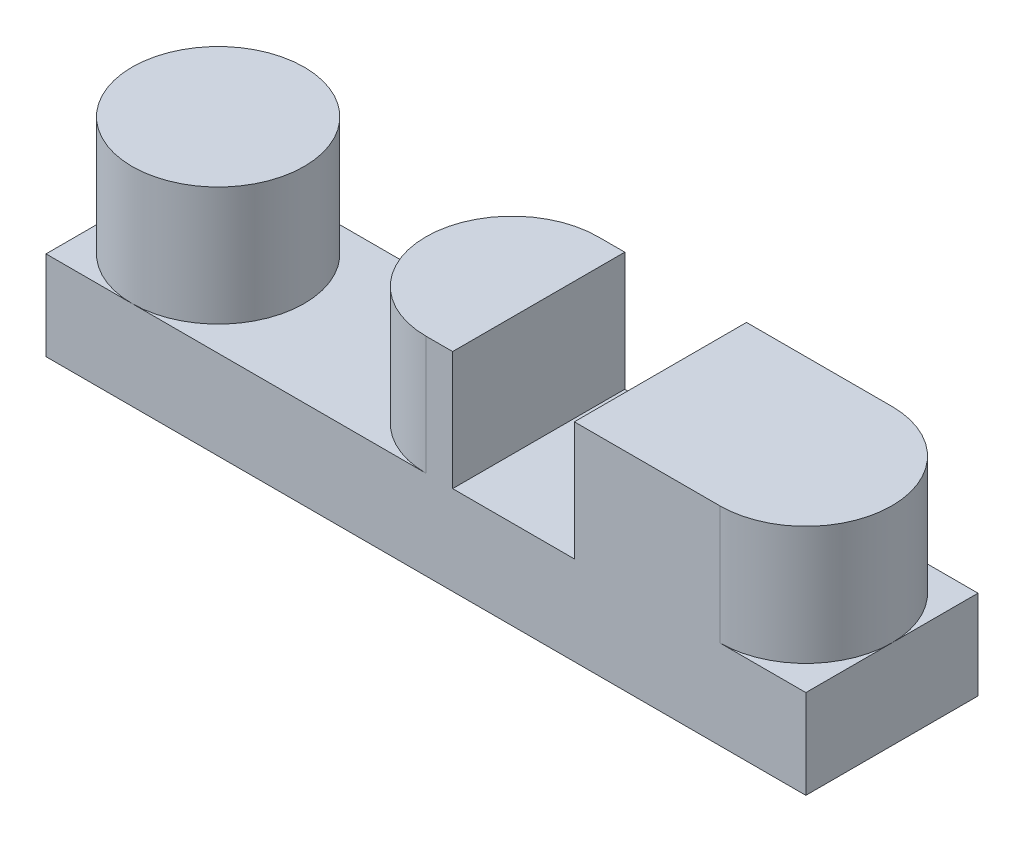
ISO-10303-21;
HEADER;
FILE_DESCRIPTION(('STEP AP214'),'2;1');
FILE_NAME('part.step','',(''),(''),'','','');
FILE_SCHEMA(('AUTOMOTIVE_DESIGN { 1 0 10303 214 1 1 1 1 }'));
ENDSEC;
DATA;
#1=APPLICATION_CONTEXT('core data for automotive mechanical design processes');
#2=APPLICATION_PROTOCOL_DEFINITION('international standard','automotive_design',2000,#1);
#3=PRODUCT_CONTEXT('',#1,'mechanical');
#4=PRODUCT('Part','Part','',(#3));
#5=PRODUCT_RELATED_PRODUCT_CATEGORY('part','',(#4));
#6=PRODUCT_DEFINITION_FORMATION('','',#4);
#7=PRODUCT_DEFINITION_CONTEXT('part definition',#1,'design');
#8=PRODUCT_DEFINITION('design','',#6,#7);
#9=PRODUCT_DEFINITION_SHAPE('','',#8);
#10=(LENGTH_UNIT() NAMED_UNIT(*) SI_UNIT(.MILLI.,.METRE.));
#11=(NAMED_UNIT(*) PLANE_ANGLE_UNIT() SI_UNIT($,.RADIAN.));
#12=(NAMED_UNIT(*) SI_UNIT($,.STERADIAN.) SOLID_ANGLE_UNIT());
#13=UNCERTAINTY_MEASURE_WITH_UNIT(LENGTH_MEASURE(1.E-05),#10,'distance_accuracy_value','');
#14=(GEOMETRIC_REPRESENTATION_CONTEXT(3) GLOBAL_UNCERTAINTY_ASSIGNED_CONTEXT((#13)) GLOBAL_UNIT_ASSIGNED_CONTEXT((#10,
#11,#12)) REPRESENTATION_CONTEXT('',''));
#15=CARTESIAN_POINT('',(0.,0.,0.));
#16=DIRECTION('',(0.,0.,1.));
#17=DIRECTION('',(1.,0.,0.));
#18=AXIS2_PLACEMENT_3D('',#15,#16,#17);
#19=CARTESIAN_POINT('',(0.,0.,0.));
#20=DIRECTION('',(0.,-1.,0.));
#21=DIRECTION('',(0.,0.,-1.));
#22=AXIS2_PLACEMENT_3D('',#19,#20,#21);
#23=PLANE('',#22);
#24=CARTESIAN_POINT('',(2.9,0.,-2.9));
#25=DIRECTION('',(0.,1.,0.));
#26=DIRECTION('',(0.,0.,1.));
#27=AXIS2_PLACEMENT_3D('',#24,#25,#26);
#28=CIRCLE('',#27,2.9);
#29=CARTESIAN_POINT('',(2.9,0.,0.));
#30=VERTEX_POINT('',#29);
#31=CARTESIAN_POINT('',(2.9,0.,-5.8));
#32=VERTEX_POINT('',#31);
#33=EDGE_CURVE('E59',#30,#32,#28,.T.);
#34=ORIENTED_EDGE('',*,*,#33,.F.);
#35=DIRECTION('',(1.,0.,0.));
#36=VECTOR('',#35,1.);
#37=CARTESIAN_POINT('',(0.,0.,0.));
#38=LINE('',#37,#36);
#39=CARTESIAN_POINT('',(12.8,0.,0.));
#40=VERTEX_POINT('',#39);
#41=EDGE_CURVE('E259',#30,#40,#38,.T.);
#42=ORIENTED_EDGE('',*,*,#41,.T.);
#43=CARTESIAN_POINT('',(12.8,0.,-2.9));
#44=DIRECTION('',(0.,1.,0.));
#45=DIRECTION('',(0.,0.,1.));
#46=AXIS2_PLACEMENT_3D('',#43,#44,#45);
#47=CIRCLE('',#46,2.9);
#48=CARTESIAN_POINT('',(12.8,0.,-5.8));
#49=VERTEX_POINT('',#48);
#50=EDGE_CURVE('E74',#49,#40,#47,.T.);
#51=ORIENTED_EDGE('',*,*,#50,.F.);
#52=DIRECTION('',(1.,0.,0.));
#53=VECTOR('',#52,1.);
#54=CARTESIAN_POINT('',(0.,0.,-5.8));
#55=LINE('',#54,#53);
#56=EDGE_CURVE('E251',#32,#49,#55,.T.);
#57=ORIENTED_EDGE('',*,*,#56,.F.);
#58=EDGE_LOOP('',(#34,#42,#51,#57));
#59=FACE_BOUND('',#58,.T.);
#60=ADVANCED_FACE('F47',(#59),#23,.F.);
#61=CARTESIAN_POINT('',(0.,0.,-2.9));
#62=VERTEX_POINT('',#61);
#63=EDGE_CURVE('E11',#32,#62,#28,.T.);
#64=ORIENTED_EDGE('',*,*,#63,.F.);
#65=CARTESIAN_POINT('',(0.,0.,-5.8));
#66=VERTEX_POINT('',#65);
#67=EDGE_CURVE('E246',#66,#32,#55,.T.);
#68=ORIENTED_EDGE('',*,*,#67,.F.);
#69=DIRECTION('',(0.,0.,-1.));
#70=VECTOR('',#69,1.);
#71=CARTESIAN_POINT('',(0.,0.,0.));
#72=LINE('',#71,#70);
#73=EDGE_CURVE('E245',#62,#66,#72,.T.);
#74=ORIENTED_EDGE('',*,*,#73,.F.);
#75=EDGE_LOOP('',(#64,#68,#74));
#76=FACE_BOUND('',#75,.T.);
#77=ADVANCED_FACE('F341',(#76),#23,.F.);
#78=EDGE_CURVE('E57',#62,#30,#28,.T.);
#79=ORIENTED_EDGE('',*,*,#78,.F.);
#80=CARTESIAN_POINT('',(0.,0.,0.));
#81=VERTEX_POINT('',#80);
#82=EDGE_CURVE('E240',#81,#62,#72,.T.);
#83=ORIENTED_EDGE('',*,*,#82,.F.);
#84=EDGE_CURVE('E228',#81,#30,#38,.T.);
#85=ORIENTED_EDGE('',*,*,#84,.T.);
#86=EDGE_LOOP('',(#79,#83,#85));
#87=FACE_BOUND('',#86,.T.);
#88=ADVANCED_FACE('F346',(#87),#23,.F.);
#89=DIRECTION('',(0.,0.,-1.));
#90=VECTOR('',#89,1.);
#91=CARTESIAN_POINT('',(13.7,0.,0.));
#92=LINE('',#91,#90);
#93=CARTESIAN_POINT('',(13.7,0.,0.));
#94=VERTEX_POINT('',#93);
#95=CARTESIAN_POINT('',(13.7,0.,-5.8));
#96=VERTEX_POINT('',#95);
#97=EDGE_CURVE('E178',#94,#96,#92,.T.);
#98=ORIENTED_EDGE('',*,*,#97,.F.);
#99=CARTESIAN_POINT('',(17.8,0.,0.));
#100=VERTEX_POINT('',#99);
#101=EDGE_CURVE('E306',#94,#100,#38,.T.);
#102=ORIENTED_EDGE('',*,*,#101,.T.);
#103=DIRECTION('',(0.,0.,-1.));
#104=VECTOR('',#103,1.);
#105=CARTESIAN_POINT('',(17.8,0.,0.));
#106=LINE('',#105,#104);
#107=CARTESIAN_POINT('',(17.8,0.,-5.8));
#108=VERTEX_POINT('',#107);
#109=EDGE_CURVE('E195',#100,#108,#106,.T.);
#110=ORIENTED_EDGE('',*,*,#109,.T.);
#111=EDGE_CURVE('E300',#96,#108,#55,.T.);
#112=ORIENTED_EDGE('',*,*,#111,.F.);
#113=EDGE_LOOP('',(#98,#102,#110,#112));
#114=FACE_BOUND('',#113,.T.);
#115=ADVANCED_FACE('F305',(#114),#23,.F.);
#116=CARTESIAN_POINT('',(22.7,0.,-2.9));
#117=DIRECTION('',(0.,1.,0.));
#118=DIRECTION('',(0.,0.,1.));
#119=AXIS2_PLACEMENT_3D('',#116,#117,#118);
#120=CIRCLE('',#119,2.9);
#121=CARTESIAN_POINT('',(22.7,0.,0.));
#122=VERTEX_POINT('',#121);
#123=CARTESIAN_POINT('',(25.6,0.,-2.9));
#124=VERTEX_POINT('',#123);
#125=EDGE_CURVE('E206',#122,#124,#120,.T.);
#126=ORIENTED_EDGE('',*,*,#125,.F.);
#127=CARTESIAN_POINT('',(25.6,0.,0.));
#128=VERTEX_POINT('',#127);
#129=EDGE_CURVE('E256',#122,#128,#38,.T.);
#130=ORIENTED_EDGE('',*,*,#129,.T.);
#131=DIRECTION('',(0.,0.,-1.));
#132=VECTOR('',#131,1.);
#133=CARTESIAN_POINT('',(25.6,0.,0.));
#134=LINE('',#133,#132);
#135=EDGE_CURVE('E252',#128,#124,#134,.T.);
#136=ORIENTED_EDGE('',*,*,#135,.T.);
#137=EDGE_LOOP('',(#126,#130,#136));
#138=FACE_BOUND('',#137,.T.);
#139=ADVANCED_FACE('F314',(#138),#23,.F.);
#140=CARTESIAN_POINT('',(22.7,0.,-5.8));
#141=VERTEX_POINT('',#140);
#142=EDGE_CURVE('E209',#124,#141,#120,.T.);
#143=ORIENTED_EDGE('',*,*,#142,.F.);
#144=CARTESIAN_POINT('',(25.6,0.,-5.8));
#145=VERTEX_POINT('',#144);
#146=EDGE_CURVE('E250',#124,#145,#134,.T.);
#147=ORIENTED_EDGE('',*,*,#146,.T.);
#148=EDGE_CURVE('E244',#141,#145,#55,.T.);
#149=ORIENTED_EDGE('',*,*,#148,.F.);
#150=EDGE_LOOP('',(#143,#147,#149));
#151=FACE_BOUND('',#150,.T.);
#152=ADVANCED_FACE('F349',(#151),#23,.F.);
#153=CARTESIAN_POINT('',(0.,-3.,0.));
#154=DIRECTION('',(1.,0.,0.));
#155=DIRECTION('',(0.,0.,-1.));
#156=AXIS2_PLACEMENT_3D('',#153,#154,#155);
#157=PLANE('',#156);
#158=ORIENTED_EDGE('',*,*,#82,.T.);
#159=ORIENTED_EDGE('',*,*,#73,.T.);
#160=DIRECTION('',(0.,1.,0.));
#161=VECTOR('',#160,1.);
#162=CARTESIAN_POINT('',(0.,-3.,-5.8));
#163=LINE('',#162,#161);
#164=CARTESIAN_POINT('',(0.,-3.,-5.8));
#165=VERTEX_POINT('',#164);
#166=EDGE_CURVE('E51',#165,#66,#163,.T.);
#167=ORIENTED_EDGE('',*,*,#166,.F.);
#168=DIRECTION('',(0.,0.,-1.));
#169=VECTOR('',#168,1.);
#170=CARTESIAN_POINT('',(0.,-3.,0.));
#171=LINE('',#170,#169);
#172=CARTESIAN_POINT('',(0.,-3.,0.));
#173=VERTEX_POINT('',#172);
#174=EDGE_CURVE('E223',#173,#165,#171,.T.);
#175=ORIENTED_EDGE('',*,*,#174,.F.);
#176=DIRECTION('',(0.,1.,0.));
#177=VECTOR('',#176,1.);
#178=CARTESIAN_POINT('',(0.,-3.,0.));
#179=LINE('',#178,#177);
#180=EDGE_CURVE('E239',#173,#81,#179,.T.);
#181=ORIENTED_EDGE('',*,*,#180,.T.);
#182=EDGE_LOOP('',(#158,#159,#167,#175,#181));
#183=FACE_BOUND('',#182,.T.);
#184=ADVANCED_FACE('F49',(#183),#157,.F.);
#185=CARTESIAN_POINT('',(0.,-3.,-5.8));
#186=DIRECTION('',(0.,0.,1.));
#187=DIRECTION('',(1.,0.,0.));
#188=AXIS2_PLACEMENT_3D('',#185,#186,#187);
#189=PLANE('',#188);
#190=ORIENTED_EDGE('',*,*,#67,.T.);
#191=ORIENTED_EDGE('',*,*,#56,.T.);
#192=DIRECTION('',(0.,-1.,0.));
#193=VECTOR('',#192,1.);
#194=CARTESIAN_POINT('',(12.8,4.,-5.8));
#195=LINE('',#194,#193);
#196=CARTESIAN_POINT('',(12.8,4.,-5.8));
#197=VERTEX_POINT('',#196);
#198=EDGE_CURVE('E288',#197,#49,#195,.T.);
#199=ORIENTED_EDGE('',*,*,#198,.F.);
#200=DIRECTION('',(1.,0.,0.));
#201=VECTOR('',#200,1.);
#202=CARTESIAN_POINT('',(0.,4.,-5.8));
#203=LINE('',#202,#201);
#204=CARTESIAN_POINT('',(13.7,4.,-5.8));
#205=VERTEX_POINT('',#204);
#206=EDGE_CURVE('E174',#197,#205,#203,.T.);
#207=ORIENTED_EDGE('',*,*,#206,.T.);
#208=DIRECTION('',(0.,-1.,0.));
#209=VECTOR('',#208,1.);
#210=CARTESIAN_POINT('',(13.7,4.,-5.8));
#211=LINE('',#210,#209);
#212=EDGE_CURVE('E187',#205,#96,#211,.T.);
#213=ORIENTED_EDGE('',*,*,#212,.T.);
#214=ORIENTED_EDGE('',*,*,#111,.T.);
#215=DIRECTION('',(0.,-1.,0.));
#216=VECTOR('',#215,1.);
#217=CARTESIAN_POINT('',(17.8,4.,-5.8));
#218=LINE('',#217,#216);
#219=CARTESIAN_POINT('',(17.8,4.,-5.8));
#220=VERTEX_POINT('',#219);
#221=EDGE_CURVE('E66',#220,#108,#218,.T.);
#222=ORIENTED_EDGE('',*,*,#221,.F.);
#223=DIRECTION('',(1.,0.,0.));
#224=VECTOR('',#223,1.);
#225=CARTESIAN_POINT('',(0.,4.,-5.8));
#226=LINE('',#225,#224);
#227=CARTESIAN_POINT('',(22.7,4.,-5.8));
#228=VERTEX_POINT('',#227);
#229=EDGE_CURVE('E194',#220,#228,#226,.T.);
#230=ORIENTED_EDGE('',*,*,#229,.T.);
#231=DIRECTION('',(0.,-1.,0.));
#232=VECTOR('',#231,1.);
#233=CARTESIAN_POINT('',(22.7,4.,-5.8));
#234=LINE('',#233,#232);
#235=EDGE_CURVE('E219',#228,#141,#234,.T.);
#236=ORIENTED_EDGE('',*,*,#235,.T.);
#237=ORIENTED_EDGE('',*,*,#148,.T.);
#238=DIRECTION('',(0.,1.,0.));
#239=VECTOR('',#238,1.);
#240=CARTESIAN_POINT('',(25.6,-3.,-5.8));
#241=LINE('',#240,#239);
#242=CARTESIAN_POINT('',(25.6,-3.,-5.8));
#243=VERTEX_POINT('',#242);
#244=EDGE_CURVE('E265',#243,#145,#241,.T.);
#245=ORIENTED_EDGE('',*,*,#244,.F.);
#246=DIRECTION('',(1.,0.,0.));
#247=VECTOR('',#246,1.);
#248=CARTESIAN_POINT('',(0.,-3.,-5.8));
#249=LINE('',#248,#247);
#250=EDGE_CURVE('E227',#165,#243,#249,.T.);
#251=ORIENTED_EDGE('',*,*,#250,.F.);
#252=ORIENTED_EDGE('',*,*,#166,.T.);
#253=EDGE_LOOP('',(#190,#191,#199,#207,#213,#214,#222,#230,#236,#237,#245,#251,#252));
#254=FACE_BOUND('',#253,.T.);
#255=ADVANCED_FACE('F299',(#254),#189,.F.);
#256=CARTESIAN_POINT('',(25.6,-3.,0.));
#257=DIRECTION('',(1.,0.,0.));
#258=DIRECTION('',(0.,0.,-1.));
#259=AXIS2_PLACEMENT_3D('',#256,#257,#258);
#260=PLANE('',#259);
#261=ORIENTED_EDGE('',*,*,#135,.F.);
#262=DIRECTION('',(0.,1.,0.));
#263=VECTOR('',#262,1.);
#264=CARTESIAN_POINT('',(25.6,-3.,0.));
#265=LINE('',#264,#263);
#266=CARTESIAN_POINT('',(25.6,-3.,0.));
#267=VERTEX_POINT('',#266);
#268=EDGE_CURVE('E262',#267,#128,#265,.T.);
#269=ORIENTED_EDGE('',*,*,#268,.F.);
#270=DIRECTION('',(0.,0.,-1.));
#271=VECTOR('',#270,1.);
#272=CARTESIAN_POINT('',(25.6,-3.,0.));
#273=LINE('',#272,#271);
#274=EDGE_CURVE('E231',#267,#243,#273,.T.);
#275=ORIENTED_EDGE('',*,*,#274,.T.);
#276=ORIENTED_EDGE('',*,*,#244,.T.);
#277=ORIENTED_EDGE('',*,*,#146,.F.);
#278=EDGE_LOOP('',(#261,#269,#275,#276,#277));
#279=FACE_BOUND('',#278,.T.);
#280=ADVANCED_FACE('F319',(#279),#260,.T.);
#281=CARTESIAN_POINT('',(0.,-3.,0.));
#282=DIRECTION('',(0.,0.,1.));
#283=DIRECTION('',(1.,0.,0.));
#284=AXIS2_PLACEMENT_3D('',#281,#282,#283);
#285=PLANE('',#284);
#286=ORIENTED_EDGE('',*,*,#84,.F.);
#287=ORIENTED_EDGE('',*,*,#180,.F.);
#288=DIRECTION('',(1.,0.,0.));
#289=VECTOR('',#288,1.);
#290=CARTESIAN_POINT('',(0.,-3.,0.));
#291=LINE('',#290,#289);
#292=EDGE_CURVE('E235',#173,#267,#291,.T.);
#293=ORIENTED_EDGE('',*,*,#292,.T.);
#294=ORIENTED_EDGE('',*,*,#268,.T.);
#295=ORIENTED_EDGE('',*,*,#129,.F.);
#296=DIRECTION('',(0.,-1.,0.));
#297=VECTOR('',#296,1.);
#298=CARTESIAN_POINT('',(22.7,4.,0.));
#299=LINE('',#298,#297);
#300=CARTESIAN_POINT('',(22.7,4.,0.));
#301=VERTEX_POINT('',#300);
#302=EDGE_CURVE('E205',#301,#122,#299,.T.);
#303=ORIENTED_EDGE('',*,*,#302,.F.);
#304=DIRECTION('',(1.,0.,0.));
#305=VECTOR('',#304,1.);
#306=CARTESIAN_POINT('',(0.,4.,0.));
#307=LINE('',#306,#305);
#308=CARTESIAN_POINT('',(17.8,4.,0.));
#309=VERTEX_POINT('',#308);
#310=EDGE_CURVE('E202',#309,#301,#307,.T.);
#311=ORIENTED_EDGE('',*,*,#310,.F.);
#312=DIRECTION('',(0.,-1.,0.));
#313=VECTOR('',#312,1.);
#314=CARTESIAN_POINT('',(17.8,4.,0.));
#315=LINE('',#314,#313);
#316=EDGE_CURVE('E214',#309,#100,#315,.T.);
#317=ORIENTED_EDGE('',*,*,#316,.T.);
#318=ORIENTED_EDGE('',*,*,#101,.F.);
#319=DIRECTION('',(0.,-1.,0.));
#320=VECTOR('',#319,1.);
#321=CARTESIAN_POINT('',(13.7,4.,0.));
#322=LINE('',#321,#320);
#323=CARTESIAN_POINT('',(13.7,4.,0.));
#324=VERTEX_POINT('',#323);
#325=EDGE_CURVE('E163',#324,#94,#322,.T.);
#326=ORIENTED_EDGE('',*,*,#325,.F.);
#327=DIRECTION('',(1.,0.,0.));
#328=VECTOR('',#327,1.);
#329=CARTESIAN_POINT('',(0.,4.,0.));
#330=LINE('',#329,#328);
#331=CARTESIAN_POINT('',(12.8,4.,0.));
#332=VERTEX_POINT('',#331);
#333=EDGE_CURVE('E154',#332,#324,#330,.T.);
#334=ORIENTED_EDGE('',*,*,#333,.F.);
#335=DIRECTION('',(0.,-1.,0.));
#336=VECTOR('',#335,1.);
#337=CARTESIAN_POINT('',(12.8,4.,0.));
#338=LINE('',#337,#336);
#339=EDGE_CURVE('E160',#332,#40,#338,.T.);
#340=ORIENTED_EDGE('',*,*,#339,.T.);
#341=ORIENTED_EDGE('',*,*,#41,.F.);
#342=EDGE_LOOP('',(#286,#287,#293,#294,#295,#303,#311,#317,#318,#326,#334,#340,#341));
#343=FACE_BOUND('',#342,.T.);
#344=ADVANCED_FACE('F157',(#343),#285,.T.);
#345=CARTESIAN_POINT('',(0.,-3.,0.));
#346=DIRECTION('',(0.,-1.,0.));
#347=DIRECTION('',(0.,0.,-1.));
#348=AXIS2_PLACEMENT_3D('',#345,#346,#347);
#349=PLANE('',#348);
#350=ORIENTED_EDGE('',*,*,#174,.T.);
#351=ORIENTED_EDGE('',*,*,#250,.T.);
#352=ORIENTED_EDGE('',*,*,#274,.F.);
#353=ORIENTED_EDGE('',*,*,#292,.F.);
#354=EDGE_LOOP('',(#350,#351,#352,#353));
#355=FACE_BOUND('',#354,.T.);
#356=ADVANCED_FACE('F348',(#355),#349,.T.);
#357=CARTESIAN_POINT('',(22.7,4.,-2.9));
#358=DIRECTION('',(0.,-1.,0.));
#359=DIRECTION('',(0.,0.,-1.));
#360=AXIS2_PLACEMENT_3D('',#357,#358,#359);
#361=CYLINDRICAL_SURFACE('',#360,2.9);
#362=ORIENTED_EDGE('',*,*,#125,.T.);
#363=ORIENTED_EDGE('',*,*,#142,.T.);
#364=ORIENTED_EDGE('',*,*,#235,.F.);
#365=CARTESIAN_POINT('',(22.7,4.,-2.9));
#366=DIRECTION('',(0.,1.,0.));
#367=DIRECTION('',(0.,0.,1.));
#368=AXIS2_PLACEMENT_3D('',#365,#366,#367);
#369=CIRCLE('',#368,2.9);
#370=EDGE_CURVE('E191',#301,#228,#369,.T.);
#371=ORIENTED_EDGE('',*,*,#370,.F.);
#372=ORIENTED_EDGE('',*,*,#302,.T.);
#373=EDGE_LOOP('',(#362,#363,#364,#371,#372));
#374=FACE_BOUND('',#373,.T.);
#375=ADVANCED_FACE('F439',(#374),#361,.T.);
#376=CARTESIAN_POINT('',(17.8,4.,0.));
#377=DIRECTION('',(-1.,0.,0.));
#378=DIRECTION('',(0.,0.,1.));
#379=AXIS2_PLACEMENT_3D('',#376,#377,#378);
#380=PLANE('',#379);
#381=ORIENTED_EDGE('',*,*,#109,.F.);
#382=ORIENTED_EDGE('',*,*,#316,.F.);
#383=DIRECTION('',(0.,0.,-1.));
#384=VECTOR('',#383,1.);
#385=CARTESIAN_POINT('',(17.8,4.,0.));
#386=LINE('',#385,#384);
#387=EDGE_CURVE('E199',#309,#220,#386,.T.);
#388=ORIENTED_EDGE('',*,*,#387,.T.);
#389=ORIENTED_EDGE('',*,*,#221,.T.);
#390=EDGE_LOOP('',(#381,#382,#388,#389));
#391=FACE_BOUND('',#390,.T.);
#392=ADVANCED_FACE('F443',(#391),#380,.T.);
#393=CARTESIAN_POINT('',(0.,4.,0.));
#394=DIRECTION('',(0.,1.,0.));
#395=DIRECTION('',(0.,0.,1.));
#396=AXIS2_PLACEMENT_3D('',#393,#394,#395);
#397=PLANE('',#396);
#398=ORIENTED_EDGE('',*,*,#370,.T.);
#399=ORIENTED_EDGE('',*,*,#229,.F.);
#400=ORIENTED_EDGE('',*,*,#387,.F.);
#401=ORIENTED_EDGE('',*,*,#310,.T.);
#402=EDGE_LOOP('',(#398,#399,#400,#401));
#403=FACE_BOUND('',#402,.T.);
#404=ADVANCED_FACE('F452',(#403),#397,.T.);
#405=CARTESIAN_POINT('',(12.8,4.,-2.9));
#406=DIRECTION('',(0.,-1.,0.));
#407=DIRECTION('',(0.,0.,-1.));
#408=AXIS2_PLACEMENT_3D('',#405,#406,#407);
#409=CYLINDRICAL_SURFACE('',#408,2.9);
#410=ORIENTED_EDGE('',*,*,#50,.T.);
#411=ORIENTED_EDGE('',*,*,#339,.F.);
#412=CARTESIAN_POINT('',(12.8,4.,-2.9));
#413=DIRECTION('',(0.,1.,0.));
#414=DIRECTION('',(0.,0.,1.));
#415=AXIS2_PLACEMENT_3D('',#412,#413,#414);
#416=CIRCLE('',#415,2.9);
#417=EDGE_CURVE('E168',#197,#332,#416,.T.);
#418=ORIENTED_EDGE('',*,*,#417,.F.);
#419=ORIENTED_EDGE('',*,*,#198,.T.);
#420=EDGE_LOOP('',(#410,#411,#418,#419));
#421=FACE_BOUND('',#420,.T.);
#422=ADVANCED_FACE('F180',(#421),#409,.T.);
#423=CARTESIAN_POINT('',(13.7,4.,0.));
#424=DIRECTION('',(-1.,0.,0.));
#425=DIRECTION('',(0.,0.,1.));
#426=AXIS2_PLACEMENT_3D('',#423,#424,#425);
#427=PLANE('',#426);
#428=ORIENTED_EDGE('',*,*,#97,.T.);
#429=ORIENTED_EDGE('',*,*,#212,.F.);
#430=DIRECTION('',(0.,0.,-1.));
#431=VECTOR('',#430,1.);
#432=CARTESIAN_POINT('',(13.7,4.,0.));
#433=LINE('',#432,#431);
#434=EDGE_CURVE('E167',#324,#205,#433,.T.);
#435=ORIENTED_EDGE('',*,*,#434,.F.);
#436=ORIENTED_EDGE('',*,*,#325,.T.);
#437=EDGE_LOOP('',(#428,#429,#435,#436));
#438=FACE_BOUND('',#437,.T.);
#439=ADVANCED_FACE('F302',(#438),#427,.F.);
#440=CARTESIAN_POINT('',(0.,4.,0.));
#441=DIRECTION('',(0.,1.,0.));
#442=DIRECTION('',(0.,0.,1.));
#443=AXIS2_PLACEMENT_3D('',#440,#441,#442);
#444=PLANE('',#443);
#445=ORIENTED_EDGE('',*,*,#417,.T.);
#446=ORIENTED_EDGE('',*,*,#333,.T.);
#447=ORIENTED_EDGE('',*,*,#434,.T.);
#448=ORIENTED_EDGE('',*,*,#206,.F.);
#449=EDGE_LOOP('',(#445,#446,#447,#448));
#450=FACE_BOUND('',#449,.T.);
#451=ADVANCED_FACE('F172',(#450),#444,.T.);
#452=CARTESIAN_POINT('',(2.9,4.,-2.9));
#453=DIRECTION('',(0.,-1.,0.));
#454=DIRECTION('',(0.,0.,-1.));
#455=AXIS2_PLACEMENT_3D('',#452,#453,#454);
#456=CYLINDRICAL_SURFACE('',#455,2.9);
#457=CARTESIAN_POINT('',(2.9,4.,-2.9));
#458=DIRECTION('',(0.,1.,0.));
#459=DIRECTION('',(0.,0.,1.));
#460=AXIS2_PLACEMENT_3D('',#457,#458,#459);
#461=CIRCLE('',#460,2.9);
#462=CARTESIAN_POINT('',(2.9,4.,0.));
#463=VERTEX_POINT('',#462);
#464=EDGE_CURVE('E186',#463,#463,#461,.T.);
#465=ORIENTED_EDGE('',*,*,#464,.F.);
#466=EDGE_LOOP('',(#465));
#467=FACE_BOUND('',#466,.T.);
#468=ORIENTED_EDGE('',*,*,#33,.T.);
#469=ORIENTED_EDGE('',*,*,#63,.T.);
#470=ORIENTED_EDGE('',*,*,#78,.T.);
#471=EDGE_LOOP('',(#468,#469,#470));
#472=FACE_BOUND('',#471,.T.);
#473=ADVANCED_FACE('F334',(#467,#472),#456,.T.);
#474=CARTESIAN_POINT('',(0.,4.,0.));
#475=DIRECTION('',(0.,1.,0.));
#476=DIRECTION('',(0.,0.,1.));
#477=AXIS2_PLACEMENT_3D('',#474,#475,#476);
#478=PLANE('',#477);
#479=ORIENTED_EDGE('',*,*,#464,.T.);
#480=EDGE_LOOP('',(#479));
#481=FACE_BOUND('',#480,.T.);
#482=ADVANCED_FACE('F332',(#481),#478,.T.);
#483=CLOSED_SHELL('',(#60,#77,#88,#115,#139,#152,#184,#255,#280,#344,#356,#375,#392,#404,#422,
#439,#451,#473,#482));
#484=MANIFOLD_SOLID_BREP('B2',#483);
#485=ADVANCED_BREP_SHAPE_REPRESENTATION('',(#18,#484),#14);
#486=SHAPE_DEFINITION_REPRESENTATION(#9,#485);
ENDSEC;
END-ISO-10303-21;
